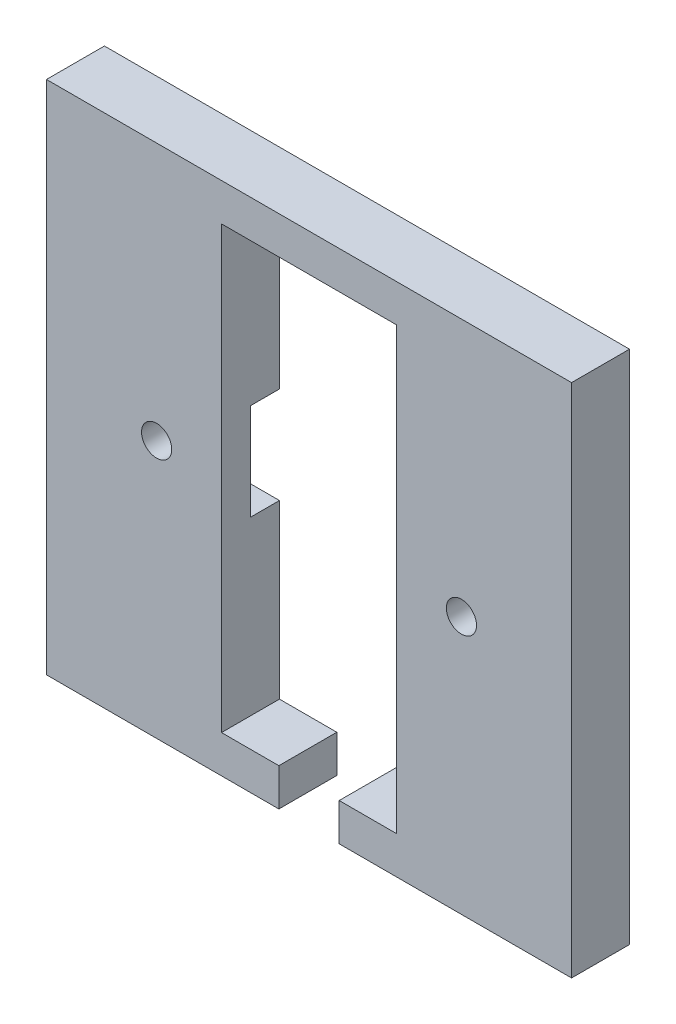
ISO-10303-21;
HEADER;
FILE_DESCRIPTION(('STEP AP214'),'2;1');
FILE_NAME('part.step','',(''),(''),'','','');
FILE_SCHEMA(('AUTOMOTIVE_DESIGN { 1 0 10303 214 1 1 1 1 }'));
ENDSEC;
DATA;
#1=APPLICATION_CONTEXT('core data for automotive mechanical design processes');
#2=APPLICATION_PROTOCOL_DEFINITION('international standard','automotive_design',2000,#1);
#3=PRODUCT_CONTEXT('',#1,'mechanical');
#4=PRODUCT('Part','Part','',(#3));
#5=PRODUCT_RELATED_PRODUCT_CATEGORY('part','',(#4));
#6=PRODUCT_DEFINITION_FORMATION('','',#4);
#7=PRODUCT_DEFINITION_CONTEXT('part definition',#1,'design');
#8=PRODUCT_DEFINITION('design','',#6,#7);
#9=PRODUCT_DEFINITION_SHAPE('','',#8);
#10=(LENGTH_UNIT() NAMED_UNIT(*) SI_UNIT(.MILLI.,.METRE.));
#11=(NAMED_UNIT(*) PLANE_ANGLE_UNIT() SI_UNIT($,.RADIAN.));
#12=(NAMED_UNIT(*) SI_UNIT($,.STERADIAN.) SOLID_ANGLE_UNIT());
#13=UNCERTAINTY_MEASURE_WITH_UNIT(LENGTH_MEASURE(1.E-05),#10,'distance_accuracy_value','');
#14=(GEOMETRIC_REPRESENTATION_CONTEXT(3) GLOBAL_UNCERTAINTY_ASSIGNED_CONTEXT((#13)) GLOBAL_UNIT_ASSIGNED_CONTEXT((#10,
#11,#12)) REPRESENTATION_CONTEXT('',''));
#15=CARTESIAN_POINT('',(0.,0.,0.));
#16=DIRECTION('',(0.,0.,1.));
#17=DIRECTION('',(1.,0.,0.));
#18=AXIS2_PLACEMENT_3D('',#15,#16,#17);
#19=CARTESIAN_POINT('',(-21.75,-21.3584716939112,4.8));
#20=DIRECTION('',(0.,1.,0.));
#21=DIRECTION('',(0.,0.,1.));
#22=AXIS2_PLACEMENT_3D('',#19,#20,#21);
#23=PLANE('',#22);
#24=DIRECTION('',(1.,0.,0.));
#25=VECTOR('',#24,1.);
#26=CARTESIAN_POINT('',(-21.75,-21.3584716939112,4.8));
#27=LINE('',#26,#25);
#28=CARTESIAN_POINT('',(2.5,-21.3584716939112,4.8));
#29=VERTEX_POINT('',#28);
#30=CARTESIAN_POINT('',(21.75,-21.3584716939112,4.8));
#31=VERTEX_POINT('',#30);
#32=EDGE_CURVE('E194',#29,#31,#27,.T.);
#33=ORIENTED_EDGE('',*,*,#32,.F.);
#34=DIRECTION('',(0.,0.,-1.));
#35=VECTOR('',#34,1.);
#36=CARTESIAN_POINT('',(2.5,-21.3584716939112,4.8));
#37=LINE('',#36,#35);
#38=CARTESIAN_POINT('',(2.5,-21.3584716939112,0.));
#39=VERTEX_POINT('',#38);
#40=EDGE_CURVE('E179',#29,#39,#37,.T.);
#41=ORIENTED_EDGE('',*,*,#40,.T.);
#42=DIRECTION('',(1.,0.,0.));
#43=VECTOR('',#42,1.);
#44=CARTESIAN_POINT('',(-21.75,-21.3584716939112,0.));
#45=LINE('',#44,#43);
#46=CARTESIAN_POINT('',(21.75,-21.3584716939112,0.));
#47=VERTEX_POINT('',#46);
#48=EDGE_CURVE('E224',#39,#47,#45,.T.);
#49=ORIENTED_EDGE('',*,*,#48,.T.);
#50=DIRECTION('',(0.,0.,-1.));
#51=VECTOR('',#50,1.);
#52=CARTESIAN_POINT('',(21.75,-21.3584716939112,4.8));
#53=LINE('',#52,#51);
#54=EDGE_CURVE('E202',#31,#47,#53,.T.);
#55=ORIENTED_EDGE('',*,*,#54,.F.);
#56=EDGE_LOOP('',(#33,#41,#49,#55));
#57=FACE_BOUND('',#56,.T.);
#58=ADVANCED_FACE('F43',(#57),#23,.F.);
#59=CARTESIAN_POINT('',(0.,-18.25,-1.2E-05));
#60=DIRECTION('',(0.,-1.,0.));
#61=DIRECTION('',(0.,0.,-1.));
#62=AXIS2_PLACEMENT_3D('',#59,#60,#61);
#63=PLANE('',#62);
#64=DIRECTION('',(-1.,0.,0.));
#65=VECTOR('',#64,1.);
#66=CARTESIAN_POINT('',(0.,-18.25,0.));
#67=LINE('',#66,#65);
#68=CARTESIAN_POINT('',(7.25000000000001,-18.25,0.));
#69=VERTEX_POINT('',#68);
#70=CARTESIAN_POINT('',(2.5,-18.25,0.));
#71=VERTEX_POINT('',#70);
#72=EDGE_CURVE('E247',#69,#71,#67,.T.);
#73=ORIENTED_EDGE('',*,*,#72,.T.);
#74=DIRECTION('',(0.,0.,-1.));
#75=VECTOR('',#74,1.);
#76=CARTESIAN_POINT('',(2.5,-18.25,4.8));
#77=LINE('',#76,#75);
#78=CARTESIAN_POINT('',(2.5,-18.25,4.8));
#79=VERTEX_POINT('',#78);
#80=EDGE_CURVE('E366',#79,#71,#77,.T.);
#81=ORIENTED_EDGE('',*,*,#80,.F.);
#82=DIRECTION('',(1.,0.,0.));
#83=VECTOR('',#82,1.);
#84=CARTESIAN_POINT('',(0.,-18.25,4.8));
#85=LINE('',#84,#83);
#86=CARTESIAN_POINT('',(7.25000000000001,-18.25,4.8));
#87=VERTEX_POINT('',#86);
#88=EDGE_CURVE('E197',#79,#87,#85,.T.);
#89=ORIENTED_EDGE('',*,*,#88,.T.);
#90=DIRECTION('',(0.,0.,1.));
#91=VECTOR('',#90,1.);
#92=CARTESIAN_POINT('',(7.25000000000001,-18.25,-1.2E-05));
#93=LINE('',#92,#91);
#94=EDGE_CURVE('E282',#69,#87,#93,.T.);
#95=ORIENTED_EDGE('',*,*,#94,.F.);
#96=EDGE_LOOP('',(#73,#81,#89,#95));
#97=FACE_BOUND('',#96,.T.);
#98=ADVANCED_FACE('F432',(#97),#63,.F.);
#99=CARTESIAN_POINT('',(0.,0.,0.));
#100=DIRECTION('',(0.,0.,-1.));
#101=DIRECTION('',(-1.,0.,0.));
#102=AXIS2_PLACEMENT_3D('',#99,#100,#101);
#103=PLANE('',#102);
#104=DIRECTION('',(0.,-1.,0.));
#105=VECTOR('',#104,1.);
#106=CARTESIAN_POINT('',(2.5,-18.25,0.));
#107=LINE('',#106,#105);
#108=EDGE_CURVE('E182',#71,#39,#107,.T.);
#109=ORIENTED_EDGE('',*,*,#108,.F.);
#110=ORIENTED_EDGE('',*,*,#72,.F.);
#111=DIRECTION('',(0.,1.,0.));
#112=VECTOR('',#111,1.);
#113=CARTESIAN_POINT('',(7.24999999999999,0.,0.));
#114=LINE('',#113,#112);
#115=CARTESIAN_POINT('',(7.24999999999999,-4.00000000000001,0.));
#116=VERTEX_POINT('',#115);
#117=EDGE_CURVE('E252',#69,#116,#114,.T.);
#118=ORIENTED_EDGE('',*,*,#117,.T.);
#119=DIRECTION('',(-1.,0.,0.));
#120=VECTOR('',#119,1.);
#121=CARTESIAN_POINT('',(0.,-4.00000000000001,0.));
#122=LINE('',#121,#120);
#123=CARTESIAN_POINT('',(19.25,-4.,0.));
#124=VERTEX_POINT('',#123);
#125=EDGE_CURVE('E363',#124,#116,#122,.T.);
#126=ORIENTED_EDGE('',*,*,#125,.F.);
#127=DIRECTION('',(0.,1.,0.));
#128=VECTOR('',#127,1.);
#129=CARTESIAN_POINT('',(19.25,0.,0.));
#130=LINE('',#129,#128);
#131=CARTESIAN_POINT('',(19.25,4.,0.));
#132=VERTEX_POINT('',#131);
#133=EDGE_CURVE('E359',#124,#132,#130,.T.);
#134=ORIENTED_EDGE('',*,*,#133,.T.);
#135=DIRECTION('',(-1.,0.,0.));
#136=VECTOR('',#135,1.);
#137=CARTESIAN_POINT('',(0.,3.99999999999999,0.));
#138=LINE('',#137,#136);
#139=CARTESIAN_POINT('',(7.25,3.99999999999999,0.));
#140=VERTEX_POINT('',#139);
#141=EDGE_CURVE('E354',#132,#140,#138,.T.);
#142=ORIENTED_EDGE('',*,*,#141,.T.);
#143=CARTESIAN_POINT('',(7.25,18.25,0.));
#144=VERTEX_POINT('',#143);
#145=EDGE_CURVE('E251',#140,#144,#114,.T.);
#146=ORIENTED_EDGE('',*,*,#145,.T.);
#147=DIRECTION('',(-1.,0.,0.));
#148=VECTOR('',#147,1.);
#149=CARTESIAN_POINT('',(0.,18.25,0.));
#150=LINE('',#149,#148);
#151=CARTESIAN_POINT('',(-7.25,18.25,0.));
#152=VERTEX_POINT('',#151);
#153=EDGE_CURVE('E255',#144,#152,#150,.T.);
#154=ORIENTED_EDGE('',*,*,#153,.T.);
#155=DIRECTION('',(0.,1.,0.));
#156=VECTOR('',#155,1.);
#157=CARTESIAN_POINT('',(-7.24999999999999,0.,0.));
#158=LINE('',#157,#156);
#159=CARTESIAN_POINT('',(-7.25,3.99999999999999,0.));
#160=VERTEX_POINT('',#159);
#161=EDGE_CURVE('E52',#160,#152,#158,.T.);
#162=ORIENTED_EDGE('',*,*,#161,.F.);
#163=DIRECTION('',(1.,0.,0.));
#164=VECTOR('',#163,1.);
#165=CARTESIAN_POINT('',(0.,3.99999999999999,0.));
#166=LINE('',#165,#164);
#167=CARTESIAN_POINT('',(-19.25,4.,0.));
#168=VERTEX_POINT('',#167);
#169=EDGE_CURVE('E398',#168,#160,#166,.T.);
#170=ORIENTED_EDGE('',*,*,#169,.F.);
#171=DIRECTION('',(0.,1.,0.));
#172=VECTOR('',#171,1.);
#173=CARTESIAN_POINT('',(-19.25,0.,0.));
#174=LINE('',#173,#172);
#175=CARTESIAN_POINT('',(-19.25,-4.,0.));
#176=VERTEX_POINT('',#175);
#177=EDGE_CURVE('E393',#176,#168,#174,.T.);
#178=ORIENTED_EDGE('',*,*,#177,.F.);
#179=DIRECTION('',(1.,0.,0.));
#180=VECTOR('',#179,1.);
#181=CARTESIAN_POINT('',(0.,-4.00000000000001,0.));
#182=LINE('',#181,#180);
#183=CARTESIAN_POINT('',(-7.24999999999999,-4.00000000000001,0.));
#184=VERTEX_POINT('',#183);
#185=EDGE_CURVE('E343',#176,#184,#182,.T.);
#186=ORIENTED_EDGE('',*,*,#185,.T.);
#187=CARTESIAN_POINT('',(-7.25000000000001,-18.25,0.));
#188=VERTEX_POINT('',#187);
#189=EDGE_CURVE('E11',#188,#184,#158,.T.);
#190=ORIENTED_EDGE('',*,*,#189,.F.);
#191=CARTESIAN_POINT('',(-2.5,-18.25,0.));
#192=VERTEX_POINT('',#191);
#193=EDGE_CURVE('E237',#192,#188,#67,.T.);
#194=ORIENTED_EDGE('',*,*,#193,.F.);
#195=DIRECTION('',(0.,1.,0.));
#196=VECTOR('',#195,1.);
#197=CARTESIAN_POINT('',(-2.5,-18.25,0.));
#198=LINE('',#197,#196);
#199=CARTESIAN_POINT('',(-2.5,-21.3584716939112,0.));
#200=VERTEX_POINT('',#199);
#201=EDGE_CURVE('E67',#200,#192,#198,.T.);
#202=ORIENTED_EDGE('',*,*,#201,.F.);
#203=CARTESIAN_POINT('',(-21.75,-21.3584716939112,0.));
#204=VERTEX_POINT('',#203);
#205=EDGE_CURVE('E225',#204,#200,#45,.T.);
#206=ORIENTED_EDGE('',*,*,#205,.F.);
#207=DIRECTION('',(0.,-1.,0.));
#208=VECTOR('',#207,1.);
#209=CARTESIAN_POINT('',(-21.75,18.25,0.));
#210=LINE('',#209,#208);
#211=CARTESIAN_POINT('',(-21.75,21.3584716939112,0.));
#212=VERTEX_POINT('',#211);
#213=EDGE_CURVE('E229',#212,#204,#210,.T.);
#214=ORIENTED_EDGE('',*,*,#213,.F.);
#215=DIRECTION('',(1.,0.,0.));
#216=VECTOR('',#215,1.);
#217=CARTESIAN_POINT('',(-21.75,21.3584716939112,0.));
#218=LINE('',#217,#216);
#219=CARTESIAN_POINT('',(21.75,21.3584716939112,0.));
#220=VERTEX_POINT('',#219);
#221=EDGE_CURVE('E215',#212,#220,#218,.T.);
#222=ORIENTED_EDGE('',*,*,#221,.T.);
#223=DIRECTION('',(0.,-1.,0.));
#224=VECTOR('',#223,1.);
#225=CARTESIAN_POINT('',(21.75,-18.25,0.));
#226=LINE('',#225,#224);
#227=EDGE_CURVE('E219',#220,#47,#226,.T.);
#228=ORIENTED_EDGE('',*,*,#227,.T.);
#229=ORIENTED_EDGE('',*,*,#48,.F.);
#230=EDGE_LOOP('',(#109,#110,#118,#126,#134,#142,#146,#154,#162,#170,#178,#186,#190,#194,#202,
#206,#214,#222,#228,#229));
#231=FACE_BOUND('',#230,.T.);
#232=ADVANCED_FACE('F431',(#231),#103,.T.);
#233=CARTESIAN_POINT('',(-7.24999999999999,0.,-1.2E-05));
#234=DIRECTION('',(-1.,0.,0.));
#235=DIRECTION('',(0.,-1.,0.));
#236=AXIS2_PLACEMENT_3D('',#233,#234,#235);
#237=PLANE('',#236);
#238=DIRECTION('',(0.,0.,-1.));
#239=VECTOR('',#238,1.);
#240=CARTESIAN_POINT('',(-7.24999999999999,-4.00000000000001,2.4));
#241=LINE('',#240,#239);
#242=CARTESIAN_POINT('',(-7.24999999999999,-4.00000000000001,2.4));
#243=VERTEX_POINT('',#242);
#244=EDGE_CURVE('E335',#243,#184,#241,.T.);
#245=ORIENTED_EDGE('',*,*,#244,.F.);
#246=DIRECTION('',(0.,-1.,0.));
#247=VECTOR('',#246,1.);
#248=CARTESIAN_POINT('',(-7.24999999999999,0.,2.4));
#249=LINE('',#248,#247);
#250=CARTESIAN_POINT('',(-7.24999999999998,4.,2.4));
#251=VERTEX_POINT('',#250);
#252=EDGE_CURVE('E414',#251,#243,#249,.T.);
#253=ORIENTED_EDGE('',*,*,#252,.F.);
#254=DIRECTION('',(0.,0.,-1.));
#255=VECTOR('',#254,1.);
#256=CARTESIAN_POINT('',(-7.25,3.99999999999999,2.4));
#257=LINE('',#256,#255);
#258=EDGE_CURVE('E270',#251,#160,#257,.T.);
#259=ORIENTED_EDGE('',*,*,#258,.T.);
#260=ORIENTED_EDGE('',*,*,#161,.T.);
#261=DIRECTION('',(0.,0.,1.));
#262=VECTOR('',#261,1.);
#263=CARTESIAN_POINT('',(-7.25,18.25,-1.2E-05));
#264=LINE('',#263,#262);
#265=CARTESIAN_POINT('',(-7.25,18.25,4.8));
#266=VERTEX_POINT('',#265);
#267=EDGE_CURVE('E220',#152,#266,#264,.T.);
#268=ORIENTED_EDGE('',*,*,#267,.T.);
#269=DIRECTION('',(0.,-1.,0.));
#270=VECTOR('',#269,1.);
#271=CARTESIAN_POINT('',(-7.24999999999999,0.,4.8));
#272=LINE('',#271,#270);
#273=CARTESIAN_POINT('',(-7.25000000000001,-18.25,4.8));
#274=VERTEX_POINT('',#273);
#275=EDGE_CURVE('E326',#266,#274,#272,.T.);
#276=ORIENTED_EDGE('',*,*,#275,.T.);
#277=DIRECTION('',(0.,0.,1.));
#278=VECTOR('',#277,1.);
#279=CARTESIAN_POINT('',(-7.25000000000001,-18.25,-1.2E-05));
#280=LINE('',#279,#278);
#281=EDGE_CURVE('E290',#188,#274,#280,.T.);
#282=ORIENTED_EDGE('',*,*,#281,.F.);
#283=ORIENTED_EDGE('',*,*,#189,.T.);
#284=EDGE_LOOP('',(#245,#253,#259,#260,#268,#276,#282,#283));
#285=FACE_BOUND('',#284,.T.);
#286=ADVANCED_FACE('F266',(#285),#237,.F.);
#287=CARTESIAN_POINT('',(0.,0.,4.8));
#288=DIRECTION('',(0.,0.,-1.));
#289=DIRECTION('',(-1.,0.,0.));
#290=AXIS2_PLACEMENT_3D('',#287,#288,#289);
#291=PLANE('',#290);
#292=ORIENTED_EDGE('',*,*,#88,.F.);
#293=DIRECTION('',(0.,-1.,0.));
#294=VECTOR('',#293,1.);
#295=CARTESIAN_POINT('',(2.5,-18.25,4.8));
#296=LINE('',#295,#294);
#297=EDGE_CURVE('E59',#79,#29,#296,.T.);
#298=ORIENTED_EDGE('',*,*,#297,.T.);
#299=ORIENTED_EDGE('',*,*,#32,.T.);
#300=DIRECTION('',(0.,1.,0.));
#301=VECTOR('',#300,1.);
#302=CARTESIAN_POINT('',(21.75,18.25,4.8));
#303=LINE('',#302,#301);
#304=CARTESIAN_POINT('',(21.75,21.3584716939112,4.8));
#305=VERTEX_POINT('',#304);
#306=EDGE_CURVE('E205',#31,#305,#303,.T.);
#307=ORIENTED_EDGE('',*,*,#306,.T.);
#308=DIRECTION('',(1.,0.,0.));
#309=VECTOR('',#308,1.);
#310=CARTESIAN_POINT('',(-21.75,21.3584716939112,4.8));
#311=LINE('',#310,#309);
#312=CARTESIAN_POINT('',(-21.75,21.3584716939112,4.8));
#313=VERTEX_POINT('',#312);
#314=EDGE_CURVE('E211',#313,#305,#311,.T.);
#315=ORIENTED_EDGE('',*,*,#314,.F.);
#316=DIRECTION('',(0.,1.,0.));
#317=VECTOR('',#316,1.);
#318=CARTESIAN_POINT('',(-21.75,18.25,4.8));
#319=LINE('',#318,#317);
#320=CARTESIAN_POINT('',(-21.75,-21.3584716939112,4.8));
#321=VERTEX_POINT('',#320);
#322=EDGE_CURVE('E232',#321,#313,#319,.T.);
#323=ORIENTED_EDGE('',*,*,#322,.F.);
#324=CARTESIAN_POINT('',(-2.5,-21.3584716939112,4.8));
#325=VERTEX_POINT('',#324);
#326=EDGE_CURVE('E204',#321,#325,#27,.T.);
#327=ORIENTED_EDGE('',*,*,#326,.T.);
#328=DIRECTION('',(0.,1.,0.));
#329=VECTOR('',#328,1.);
#330=CARTESIAN_POINT('',(-2.5,-18.25,4.8));
#331=LINE('',#330,#329);
#332=CARTESIAN_POINT('',(-2.5,-18.25,4.8));
#333=VERTEX_POINT('',#332);
#334=EDGE_CURVE('E188',#325,#333,#331,.T.);
#335=ORIENTED_EDGE('',*,*,#334,.T.);
#336=EDGE_CURVE('E313',#274,#333,#85,.T.);
#337=ORIENTED_EDGE('',*,*,#336,.F.);
#338=ORIENTED_EDGE('',*,*,#275,.F.);
#339=DIRECTION('',(1.,0.,0.));
#340=VECTOR('',#339,1.);
#341=CARTESIAN_POINT('',(0.,18.25,4.8));
#342=LINE('',#341,#340);
#343=CARTESIAN_POINT('',(7.25,18.25,4.8));
#344=VERTEX_POINT('',#343);
#345=EDGE_CURVE('E276',#266,#344,#342,.T.);
#346=ORIENTED_EDGE('',*,*,#345,.T.);
#347=DIRECTION('',(0.,-1.,0.));
#348=VECTOR('',#347,1.);
#349=CARTESIAN_POINT('',(7.24999999999999,0.,4.8));
#350=LINE('',#349,#348);
#351=EDGE_CURVE('E322',#344,#87,#350,.T.);
#352=ORIENTED_EDGE('',*,*,#351,.T.);
#353=EDGE_LOOP('',(#292,#298,#299,#307,#315,#323,#327,#335,#337,#338,#346,#352));
#354=FACE_BOUND('',#353,.T.);
#355=CARTESIAN_POINT('',(12.6254382140631,0.,4.8));
#356=DIRECTION('',(0.,0.,-1.));
#357=DIRECTION('',(-1.,0.,0.));
#358=AXIS2_PLACEMENT_3D('',#355,#356,#357);
#359=CIRCLE('',#358,1.25);
#360=CARTESIAN_POINT('',(13.8754382140631,0.,4.8));
#361=VERTEX_POINT('',#360);
#362=EDGE_CURVE('E331',#361,#361,#359,.T.);
#363=ORIENTED_EDGE('',*,*,#362,.T.);
#364=EDGE_LOOP('',(#363));
#365=FACE_BOUND('',#364,.T.);
#366=CARTESIAN_POINT('',(-12.6254382140631,0.,4.8));
#367=DIRECTION('',(0.,0.,1.));
#368=DIRECTION('',(1.,0.,0.));
#369=AXIS2_PLACEMENT_3D('',#366,#367,#368);
#370=CIRCLE('',#369,1.25);
#371=CARTESIAN_POINT('',(-11.3754382140631,0.,4.8));
#372=VERTEX_POINT('',#371);
#373=EDGE_CURVE('E330',#372,#372,#370,.T.);
#374=ORIENTED_EDGE('',*,*,#373,.F.);
#375=EDGE_LOOP('',(#374));
#376=FACE_BOUND('',#375,.T.);
#377=ADVANCED_FACE('F192',(#354,#365,#376),#291,.F.);
#378=CARTESIAN_POINT('',(-21.75,18.25,4.8));
#379=DIRECTION('',(1.,0.,0.));
#380=DIRECTION('',(0.,0.,-1.));
#381=AXIS2_PLACEMENT_3D('',#378,#379,#380);
#382=PLANE('',#381);
#383=ORIENTED_EDGE('',*,*,#213,.T.);
#384=DIRECTION('',(0.,0.,-1.));
#385=VECTOR('',#384,1.);
#386=CARTESIAN_POINT('',(-21.75,-21.3584716939112,4.8));
#387=LINE('',#386,#385);
#388=EDGE_CURVE('E233',#321,#204,#387,.T.);
#389=ORIENTED_EDGE('',*,*,#388,.F.);
#390=ORIENTED_EDGE('',*,*,#322,.T.);
#391=DIRECTION('',(0.,0.,-1.));
#392=VECTOR('',#391,1.);
#393=CARTESIAN_POINT('',(-21.75,21.3584716939112,4.8));
#394=LINE('',#393,#392);
#395=EDGE_CURVE('E210',#313,#212,#394,.T.);
#396=ORIENTED_EDGE('',*,*,#395,.T.);
#397=EDGE_LOOP('',(#383,#389,#390,#396));
#398=FACE_BOUND('',#397,.T.);
#399=ADVANCED_FACE('F304',(#398),#382,.F.);
#400=ORIENTED_EDGE('',*,*,#205,.T.);
#401=DIRECTION('',(0.,0.,-1.));
#402=VECTOR('',#401,1.);
#403=CARTESIAN_POINT('',(-2.5,-21.3584716939112,4.8));
#404=LINE('',#403,#402);
#405=EDGE_CURVE('E187',#325,#200,#404,.T.);
#406=ORIENTED_EDGE('',*,*,#405,.F.);
#407=ORIENTED_EDGE('',*,*,#326,.F.);
#408=ORIENTED_EDGE('',*,*,#388,.T.);
#409=EDGE_LOOP('',(#400,#406,#407,#408));
#410=FACE_BOUND('',#409,.T.);
#411=ADVANCED_FACE('F309',(#410),#23,.F.);
#412=CARTESIAN_POINT('',(21.75,-18.25,4.8));
#413=DIRECTION('',(1.,0.,0.));
#414=DIRECTION('',(0.,1.,0.));
#415=AXIS2_PLACEMENT_3D('',#412,#413,#414);
#416=PLANE('',#415);
#417=ORIENTED_EDGE('',*,*,#227,.F.);
#418=DIRECTION('',(0.,0.,-1.));
#419=VECTOR('',#418,1.);
#420=CARTESIAN_POINT('',(21.75,21.3584716939112,4.8));
#421=LINE('',#420,#419);
#422=EDGE_CURVE('E240',#305,#220,#421,.T.);
#423=ORIENTED_EDGE('',*,*,#422,.F.);
#424=ORIENTED_EDGE('',*,*,#306,.F.);
#425=ORIENTED_EDGE('',*,*,#54,.T.);
#426=EDGE_LOOP('',(#417,#423,#424,#425));
#427=FACE_BOUND('',#426,.T.);
#428=ADVANCED_FACE('F486',(#427),#416,.T.);
#429=CARTESIAN_POINT('',(-21.75,21.3584716939112,4.8));
#430=DIRECTION('',(0.,1.,0.));
#431=DIRECTION('',(0.,0.,1.));
#432=AXIS2_PLACEMENT_3D('',#429,#430,#431);
#433=PLANE('',#432);
#434=ORIENTED_EDGE('',*,*,#221,.F.);
#435=ORIENTED_EDGE('',*,*,#395,.F.);
#436=ORIENTED_EDGE('',*,*,#314,.T.);
#437=ORIENTED_EDGE('',*,*,#422,.T.);
#438=EDGE_LOOP('',(#434,#435,#436,#437));
#439=FACE_BOUND('',#438,.T.);
#440=ADVANCED_FACE('F45',(#439),#433,.T.);
#441=CARTESIAN_POINT('',(0.,18.25,-1.2E-05));
#442=DIRECTION('',(0.,-1.,0.));
#443=DIRECTION('',(1.,0.,0.));
#444=AXIS2_PLACEMENT_3D('',#441,#442,#443);
#445=PLANE('',#444);
#446=DIRECTION('',(0.,0.,1.));
#447=VECTOR('',#446,1.);
#448=CARTESIAN_POINT('',(7.25,18.25,-1.2E-05));
#449=LINE('',#448,#447);
#450=EDGE_CURVE('E279',#144,#344,#449,.T.);
#451=ORIENTED_EDGE('',*,*,#450,.T.);
#452=ORIENTED_EDGE('',*,*,#345,.F.);
#453=ORIENTED_EDGE('',*,*,#267,.F.);
#454=ORIENTED_EDGE('',*,*,#153,.F.);
#455=EDGE_LOOP('',(#451,#452,#453,#454));
#456=FACE_BOUND('',#455,.T.);
#457=ADVANCED_FACE('F273',(#456),#445,.T.);
#458=CARTESIAN_POINT('',(7.24999999999999,0.,-1.2E-05));
#459=DIRECTION('',(-1.,0.,0.));
#460=DIRECTION('',(0.,-1.,0.));
#461=AXIS2_PLACEMENT_3D('',#458,#459,#460);
#462=PLANE('',#461);
#463=DIRECTION('',(0.,0.,-1.));
#464=VECTOR('',#463,1.);
#465=CARTESIAN_POINT('',(7.24999999999999,-4.00000000000001,2.4));
#466=LINE('',#465,#464);
#467=CARTESIAN_POINT('',(7.24999999999999,-4.00000000000001,2.4));
#468=VERTEX_POINT('',#467);
#469=EDGE_CURVE('E339',#468,#116,#466,.T.);
#470=ORIENTED_EDGE('',*,*,#469,.T.);
#471=ORIENTED_EDGE('',*,*,#117,.F.);
#472=ORIENTED_EDGE('',*,*,#94,.T.);
#473=ORIENTED_EDGE('',*,*,#351,.F.);
#474=ORIENTED_EDGE('',*,*,#450,.F.);
#475=ORIENTED_EDGE('',*,*,#145,.F.);
#476=DIRECTION('',(0.,0.,-1.));
#477=VECTOR('',#476,1.);
#478=CARTESIAN_POINT('',(7.25,3.99999999999999,2.4));
#479=LINE('',#478,#477);
#480=CARTESIAN_POINT('',(7.25,3.99999999999999,2.4));
#481=VERTEX_POINT('',#480);
#482=EDGE_CURVE('E350',#481,#140,#479,.T.);
#483=ORIENTED_EDGE('',*,*,#482,.F.);
#484=DIRECTION('',(0.,-1.,0.));
#485=VECTOR('',#484,1.);
#486=CARTESIAN_POINT('',(7.24999999999999,0.,2.4));
#487=LINE('',#486,#485);
#488=EDGE_CURVE('E358',#481,#468,#487,.T.);
#489=ORIENTED_EDGE('',*,*,#488,.T.);
#490=EDGE_LOOP('',(#470,#471,#472,#473,#474,#475,#483,#489));
#491=FACE_BOUND('',#490,.T.);
#492=ADVANCED_FACE('F436',(#491),#462,.T.);
#493=ORIENTED_EDGE('',*,*,#336,.T.);
#494=DIRECTION('',(0.,0.,-1.));
#495=VECTOR('',#494,1.);
#496=CARTESIAN_POINT('',(-2.5,-18.25,4.8));
#497=LINE('',#496,#495);
#498=EDGE_CURVE('E318',#333,#192,#497,.T.);
#499=ORIENTED_EDGE('',*,*,#498,.T.);
#500=ORIENTED_EDGE('',*,*,#193,.T.);
#501=ORIENTED_EDGE('',*,*,#281,.T.);
#502=EDGE_LOOP('',(#493,#499,#500,#501));
#503=FACE_BOUND('',#502,.T.);
#504=ADVANCED_FACE('F317',(#503),#63,.F.);
#505=CARTESIAN_POINT('',(12.6254382140631,0.,-1.2E-05));
#506=DIRECTION('',(0.,0.,1.));
#507=DIRECTION('',(1.,0.,0.));
#508=AXIS2_PLACEMENT_3D('',#505,#506,#507);
#509=CYLINDRICAL_SURFACE('',#508,1.25);
#510=CARTESIAN_POINT('',(12.6254382140631,0.,2.4));
#511=DIRECTION('',(0.,0.,1.));
#512=DIRECTION('',(1.,0.,0.));
#513=AXIS2_PLACEMENT_3D('',#510,#511,#512);
#514=CIRCLE('',#513,1.25);
#515=CARTESIAN_POINT('',(13.8754382140631,0.,2.4));
#516=VERTEX_POINT('',#515);
#517=EDGE_CURVE('E353',#516,#516,#514,.F.);
#518=CARTESIAN_POINT('',(13.8754382140631,0.,2.4));
#519=CARTESIAN_POINT('',(13.8754382140631,0.,2.425));
#520=CARTESIAN_POINT('',(13.8754382140631,0.,2.45));
#521=CARTESIAN_POINT('',(13.8754382140631,0.,2.5));
#522=CARTESIAN_POINT('',(13.8754382140631,0.,2.525));
#523=CARTESIAN_POINT('',(13.8754382140631,0.,2.575));
#524=CARTESIAN_POINT('',(13.8754382140631,0.,2.6));
#525=CARTESIAN_POINT('',(13.8754382140631,0.,2.65));
#526=CARTESIAN_POINT('',(13.8754382140631,0.,2.675));
#527=CARTESIAN_POINT('',(13.8754382140631,0.,2.725));
#528=CARTESIAN_POINT('',(13.8754382140631,0.,2.75));
#529=CARTESIAN_POINT('',(13.8754382140631,0.,2.8));
#530=CARTESIAN_POINT('',(13.8754382140631,0.,2.825));
#531=CARTESIAN_POINT('',(13.8754382140631,0.,2.875));
#532=CARTESIAN_POINT('',(13.8754382140631,0.,2.9));
#533=CARTESIAN_POINT('',(13.8754382140631,0.,2.95));
#534=CARTESIAN_POINT('',(13.8754382140631,0.,2.975));
#535=CARTESIAN_POINT('',(13.8754382140631,0.,3.025));
#536=CARTESIAN_POINT('',(13.8754382140631,0.,3.05));
#537=CARTESIAN_POINT('',(13.8754382140631,0.,3.1));
#538=CARTESIAN_POINT('',(13.8754382140631,0.,3.125));
#539=CARTESIAN_POINT('',(13.8754382140631,0.,3.175));
#540=CARTESIAN_POINT('',(13.8754382140631,0.,3.2));
#541=CARTESIAN_POINT('',(13.8754382140631,0.,3.25));
#542=CARTESIAN_POINT('',(13.8754382140631,0.,3.275));
#543=CARTESIAN_POINT('',(13.8754382140631,0.,3.325));
#544=CARTESIAN_POINT('',(13.8754382140631,0.,3.35));
#545=CARTESIAN_POINT('',(13.8754382140631,0.,3.4));
#546=CARTESIAN_POINT('',(13.8754382140631,0.,3.425));
#547=CARTESIAN_POINT('',(13.8754382140631,0.,3.475));
#548=CARTESIAN_POINT('',(13.8754382140631,0.,3.5));
#549=CARTESIAN_POINT('',(13.8754382140631,0.,3.55));
#550=CARTESIAN_POINT('',(13.8754382140631,0.,3.575));
#551=CARTESIAN_POINT('',(13.8754382140631,0.,3.625));
#552=CARTESIAN_POINT('',(13.8754382140631,0.,3.65));
#553=CARTESIAN_POINT('',(13.8754382140631,0.,3.7));
#554=CARTESIAN_POINT('',(13.8754382140631,0.,3.725));
#555=CARTESIAN_POINT('',(13.8754382140631,0.,3.775));
#556=CARTESIAN_POINT('',(13.8754382140631,0.,3.8));
#557=CARTESIAN_POINT('',(13.8754382140631,0.,3.85));
#558=CARTESIAN_POINT('',(13.8754382140631,0.,3.875));
#559=CARTESIAN_POINT('',(13.8754382140631,0.,3.925));
#560=CARTESIAN_POINT('',(13.8754382140631,0.,3.95));
#561=CARTESIAN_POINT('',(13.8754382140631,0.,4.));
#562=CARTESIAN_POINT('',(13.8754382140631,0.,4.025));
#563=CARTESIAN_POINT('',(13.8754382140631,0.,4.075));
#564=CARTESIAN_POINT('',(13.8754382140631,0.,4.1));
#565=CARTESIAN_POINT('',(13.8754382140631,0.,4.15));
#566=CARTESIAN_POINT('',(13.8754382140631,0.,4.175));
#567=CARTESIAN_POINT('',(13.8754382140631,0.,4.225));
#568=CARTESIAN_POINT('',(13.8754382140631,0.,4.25));
#569=CARTESIAN_POINT('',(13.8754382140631,0.,4.3));
#570=CARTESIAN_POINT('',(13.8754382140631,0.,4.325));
#571=CARTESIAN_POINT('',(13.8754382140631,0.,4.375));
#572=CARTESIAN_POINT('',(13.8754382140631,0.,4.4));
#573=CARTESIAN_POINT('',(13.8754382140631,0.,4.45));
#574=CARTESIAN_POINT('',(13.8754382140631,0.,4.475));
#575=CARTESIAN_POINT('',(13.8754382140631,0.,4.525));
#576=CARTESIAN_POINT('',(13.8754382140631,0.,4.55));
#577=CARTESIAN_POINT('',(13.8754382140631,0.,4.6));
#578=CARTESIAN_POINT('',(13.8754382140631,0.,4.625));
#579=CARTESIAN_POINT('',(13.8754382140631,0.,4.675));
#580=CARTESIAN_POINT('',(13.8754382140631,0.,4.7));
#581=CARTESIAN_POINT('',(13.8754382140631,0.,4.75));
#582=CARTESIAN_POINT('',(13.8754382140631,0.,4.775));
#583=CARTESIAN_POINT('',(13.8754382140631,0.,4.8));
#584=B_SPLINE_CURVE_WITH_KNOTS('',3,(#518,#519,#520,#521,#522,#523,#524,#525,#526,#527,#528,
#529,#530,#531,#532,#533,#534,#535,#536,#537,#538,#539,#540,#541,#542,#543,#544,#545,#546,#547,
#548,#549,#550,#551,#552,#553,#554,#555,#556,#557,#558,#559,#560,#561,#562,#563,#564,#565,#566,
#567,#568,#569,#570,#571,#572,#573,#574,#575,#576,#577,#578,#579,#580,#581,#582,#583),
.UNSPECIFIED.,.F.,.F.,(4,2,2,2,2,2,2,2,2,2,2,2,2,2,2,2,2,2,2,2,2,2,2,2,2,2,2,2,2,2,2,2,4),(0.,
0.075,0.15,0.225,0.3,0.375,0.45,0.525,0.6,0.675,0.75,0.825,0.900000000000001,0.975,1.05,1.125,
1.2,1.275,1.35,1.425,1.5,1.575,1.65,1.725,1.8,1.875,1.95,2.025,2.1,2.175,2.25,2.325,2.4),.UNSPECIFIED.);
#585=EDGE_CURVE('BSEAM502',#516,#361,#584,.T.);
#586=ORIENTED_EDGE('',*,*,#517,.T.);
#587=ORIENTED_EDGE('',*,*,#362,.F.);
#588=ORIENTED_EDGE('',*,*,#585,.T.);
#589=ORIENTED_EDGE('',*,*,#585,.F.);
#590=EDGE_LOOP('',(#586,#588,#587,#589));
#591=FACE_BOUND('',#590,.T.);
#592=ADVANCED_FACE('F502',(#591),#509,.F.);
#593=CARTESIAN_POINT('',(-12.6254382140631,0.,-1.2E-05));
#594=DIRECTION('',(0.,0.,1.));
#595=DIRECTION('',(1.,0.,0.));
#596=AXIS2_PLACEMENT_3D('',#593,#594,#595);
#597=CYLINDRICAL_SURFACE('',#596,1.25);
#598=CARTESIAN_POINT('',(-12.6254382140631,0.,2.4));
#599=DIRECTION('',(0.,0.,1.));
#600=DIRECTION('',(1.,0.,0.));
#601=AXIS2_PLACEMENT_3D('',#598,#599,#600);
#602=CIRCLE('',#601,1.25);
#603=CARTESIAN_POINT('',(-11.3754382140631,0.,2.4));
#604=VERTEX_POINT('',#603);
#605=EDGE_CURVE('E392',#604,#604,#602,.T.);
#606=CARTESIAN_POINT('',(-11.3754382140631,0.,2.4));
#607=CARTESIAN_POINT('',(-11.3754382140631,0.,2.425));
#608=CARTESIAN_POINT('',(-11.3754382140631,0.,2.45));
#609=CARTESIAN_POINT('',(-11.3754382140631,0.,2.5));
#610=CARTESIAN_POINT('',(-11.3754382140631,0.,2.525));
#611=CARTESIAN_POINT('',(-11.3754382140631,0.,2.575));
#612=CARTESIAN_POINT('',(-11.3754382140631,0.,2.6));
#613=CARTESIAN_POINT('',(-11.3754382140631,0.,2.65));
#614=CARTESIAN_POINT('',(-11.3754382140631,0.,2.675));
#615=CARTESIAN_POINT('',(-11.3754382140631,0.,2.725));
#616=CARTESIAN_POINT('',(-11.3754382140631,0.,2.75));
#617=CARTESIAN_POINT('',(-11.3754382140631,0.,2.8));
#618=CARTESIAN_POINT('',(-11.3754382140631,0.,2.825));
#619=CARTESIAN_POINT('',(-11.3754382140631,0.,2.875));
#620=CARTESIAN_POINT('',(-11.3754382140631,0.,2.9));
#621=CARTESIAN_POINT('',(-11.3754382140631,0.,2.95));
#622=CARTESIAN_POINT('',(-11.3754382140631,0.,2.975));
#623=CARTESIAN_POINT('',(-11.3754382140631,0.,3.025));
#624=CARTESIAN_POINT('',(-11.3754382140631,0.,3.05));
#625=CARTESIAN_POINT('',(-11.3754382140631,0.,3.1));
#626=CARTESIAN_POINT('',(-11.3754382140631,0.,3.125));
#627=CARTESIAN_POINT('',(-11.3754382140631,0.,3.175));
#628=CARTESIAN_POINT('',(-11.3754382140631,0.,3.2));
#629=CARTESIAN_POINT('',(-11.3754382140631,0.,3.25));
#630=CARTESIAN_POINT('',(-11.3754382140631,0.,3.275));
#631=CARTESIAN_POINT('',(-11.3754382140631,0.,3.325));
#632=CARTESIAN_POINT('',(-11.3754382140631,0.,3.35));
#633=CARTESIAN_POINT('',(-11.3754382140631,0.,3.4));
#634=CARTESIAN_POINT('',(-11.3754382140631,0.,3.425));
#635=CARTESIAN_POINT('',(-11.3754382140631,0.,3.475));
#636=CARTESIAN_POINT('',(-11.3754382140631,0.,3.5));
#637=CARTESIAN_POINT('',(-11.3754382140631,0.,3.55));
#638=CARTESIAN_POINT('',(-11.3754382140631,0.,3.575));
#639=CARTESIAN_POINT('',(-11.3754382140631,0.,3.625));
#640=CARTESIAN_POINT('',(-11.3754382140631,0.,3.65));
#641=CARTESIAN_POINT('',(-11.3754382140631,0.,3.7));
#642=CARTESIAN_POINT('',(-11.3754382140631,0.,3.725));
#643=CARTESIAN_POINT('',(-11.3754382140631,0.,3.775));
#644=CARTESIAN_POINT('',(-11.3754382140631,0.,3.8));
#645=CARTESIAN_POINT('',(-11.3754382140631,0.,3.85));
#646=CARTESIAN_POINT('',(-11.3754382140631,0.,3.875));
#647=CARTESIAN_POINT('',(-11.3754382140631,0.,3.925));
#648=CARTESIAN_POINT('',(-11.3754382140631,0.,3.95));
#649=CARTESIAN_POINT('',(-11.3754382140631,0.,4.));
#650=CARTESIAN_POINT('',(-11.3754382140631,0.,4.025));
#651=CARTESIAN_POINT('',(-11.3754382140631,0.,4.075));
#652=CARTESIAN_POINT('',(-11.3754382140631,0.,4.1));
#653=CARTESIAN_POINT('',(-11.3754382140631,0.,4.15));
#654=CARTESIAN_POINT('',(-11.3754382140631,0.,4.175));
#655=CARTESIAN_POINT('',(-11.3754382140631,0.,4.225));
#656=CARTESIAN_POINT('',(-11.3754382140631,0.,4.25));
#657=CARTESIAN_POINT('',(-11.3754382140631,0.,4.3));
#658=CARTESIAN_POINT('',(-11.3754382140631,0.,4.325));
#659=CARTESIAN_POINT('',(-11.3754382140631,0.,4.375));
#660=CARTESIAN_POINT('',(-11.3754382140631,0.,4.4));
#661=CARTESIAN_POINT('',(-11.3754382140631,0.,4.45));
#662=CARTESIAN_POINT('',(-11.3754382140631,0.,4.475));
#663=CARTESIAN_POINT('',(-11.3754382140631,0.,4.525));
#664=CARTESIAN_POINT('',(-11.3754382140631,0.,4.55));
#665=CARTESIAN_POINT('',(-11.3754382140631,0.,4.6));
#666=CARTESIAN_POINT('',(-11.3754382140631,0.,4.625));
#667=CARTESIAN_POINT('',(-11.3754382140631,0.,4.675));
#668=CARTESIAN_POINT('',(-11.3754382140631,0.,4.7));
#669=CARTESIAN_POINT('',(-11.3754382140631,0.,4.75));
#670=CARTESIAN_POINT('',(-11.3754382140631,0.,4.775));
#671=CARTESIAN_POINT('',(-11.3754382140631,0.,4.8));
#672=B_SPLINE_CURVE_WITH_KNOTS('',3,(#606,#607,#608,#609,#610,#611,#612,#613,#614,#615,#616,
#617,#618,#619,#620,#621,#622,#623,#624,#625,#626,#627,#628,#629,#630,#631,#632,#633,#634,#635,
#636,#637,#638,#639,#640,#641,#642,#643,#644,#645,#646,#647,#648,#649,#650,#651,#652,#653,#654,
#655,#656,#657,#658,#659,#660,#661,#662,#663,#664,#665,#666,#667,#668,#669,#670,#671),
.UNSPECIFIED.,.F.,.F.,(4,2,2,2,2,2,2,2,2,2,2,2,2,2,2,2,2,2,2,2,2,2,2,2,2,2,2,2,2,2,2,2,4),(0.,
0.075,0.15,0.225,0.3,0.375,0.45,0.525,0.6,0.675,0.75,0.825,0.9,0.975,1.05,1.125,1.2,1.275,1.35,
1.425,1.5,1.575,1.65,1.725,1.8,1.875,1.95,2.025,2.1,2.175,2.25,2.325,2.4),.UNSPECIFIED.);
#673=EDGE_CURVE('BSEAM509',#604,#372,#672,.T.);
#674=ORIENTED_EDGE('',*,*,#605,.F.);
#675=ORIENTED_EDGE('',*,*,#373,.T.);
#676=ORIENTED_EDGE('',*,*,#673,.T.);
#677=ORIENTED_EDGE('',*,*,#673,.F.);
#678=EDGE_LOOP('',(#674,#676,#675,#677));
#679=FACE_BOUND('',#678,.T.);
#680=ADVANCED_FACE('F509',(#679),#597,.F.);
#681=CARTESIAN_POINT('',(0.,-4.00000000000001,2.4));
#682=DIRECTION('',(0.,1.,0.));
#683=DIRECTION('',(-1.,0.,0.));
#684=AXIS2_PLACEMENT_3D('',#681,#682,#683);
#685=PLANE('',#684);
#686=ORIENTED_EDGE('',*,*,#185,.F.);
#687=DIRECTION('',(0.,0.,-1.));
#688=VECTOR('',#687,1.);
#689=CARTESIAN_POINT('',(-19.25,-4.,2.4));
#690=LINE('',#689,#688);
#691=CARTESIAN_POINT('',(-19.25,-4.,2.4));
#692=VERTEX_POINT('',#691);
#693=EDGE_CURVE('E389',#692,#176,#690,.T.);
#694=ORIENTED_EDGE('',*,*,#693,.F.);
#695=DIRECTION('',(1.,0.,0.));
#696=VECTOR('',#695,1.);
#697=CARTESIAN_POINT('',(0.,-4.00000000000001,2.4));
#698=LINE('',#697,#696);
#699=EDGE_CURVE('E397',#692,#243,#698,.T.);
#700=ORIENTED_EDGE('',*,*,#699,.T.);
#701=ORIENTED_EDGE('',*,*,#244,.T.);
#702=EDGE_LOOP('',(#686,#694,#700,#701));
#703=FACE_BOUND('',#702,.T.);
#704=ADVANCED_FACE('F459',(#703),#685,.T.);
#705=CARTESIAN_POINT('',(0.,3.99999999999999,2.4));
#706=DIRECTION('',(0.,1.,0.));
#707=DIRECTION('',(-1.,0.,0.));
#708=AXIS2_PLACEMENT_3D('',#705,#706,#707);
#709=PLANE('',#708);
#710=ORIENTED_EDGE('',*,*,#169,.T.);
#711=ORIENTED_EDGE('',*,*,#258,.F.);
#712=DIRECTION('',(1.,0.,0.));
#713=VECTOR('',#712,1.);
#714=CARTESIAN_POINT('',(0.,3.99999999999999,2.4));
#715=LINE('',#714,#713);
#716=CARTESIAN_POINT('',(-19.25,4.,2.4));
#717=VERTEX_POINT('',#716);
#718=EDGE_CURVE('E411',#717,#251,#715,.T.);
#719=ORIENTED_EDGE('',*,*,#718,.F.);
#720=DIRECTION('',(0.,0.,-1.));
#721=VECTOR('',#720,1.);
#722=CARTESIAN_POINT('',(-19.25,4.,2.4));
#723=LINE('',#722,#721);
#724=EDGE_CURVE('E386',#717,#168,#723,.T.);
#725=ORIENTED_EDGE('',*,*,#724,.T.);
#726=EDGE_LOOP('',(#710,#711,#719,#725));
#727=FACE_BOUND('',#726,.T.);
#728=ADVANCED_FACE('F467',(#727),#709,.F.);
#729=CARTESIAN_POINT('',(-19.25,0.,2.4));
#730=DIRECTION('',(-1.,0.,0.));
#731=DIRECTION('',(0.,0.,1.));
#732=AXIS2_PLACEMENT_3D('',#729,#730,#731);
#733=PLANE('',#732);
#734=ORIENTED_EDGE('',*,*,#177,.T.);
#735=ORIENTED_EDGE('',*,*,#724,.F.);
#736=DIRECTION('',(0.,1.,0.));
#737=VECTOR('',#736,1.);
#738=CARTESIAN_POINT('',(-19.25,0.,2.4));
#739=LINE('',#738,#737);
#740=EDGE_CURVE('E407',#692,#717,#739,.T.);
#741=ORIENTED_EDGE('',*,*,#740,.F.);
#742=ORIENTED_EDGE('',*,*,#693,.T.);
#743=EDGE_LOOP('',(#734,#735,#741,#742));
#744=FACE_BOUND('',#743,.T.);
#745=ADVANCED_FACE('F469',(#744),#733,.F.);
#746=CARTESIAN_POINT('',(0.,0.,2.4));
#747=DIRECTION('',(0.,0.,1.));
#748=DIRECTION('',(1.,0.,0.));
#749=AXIS2_PLACEMENT_3D('',#746,#747,#748);
#750=PLANE('',#749);
#751=ORIENTED_EDGE('',*,*,#699,.F.);
#752=ORIENTED_EDGE('',*,*,#740,.T.);
#753=ORIENTED_EDGE('',*,*,#718,.T.);
#754=ORIENTED_EDGE('',*,*,#252,.T.);
#755=EDGE_LOOP('',(#751,#752,#753,#754));
#756=FACE_BOUND('',#755,.T.);
#757=ORIENTED_EDGE('',*,*,#605,.T.);
#758=EDGE_LOOP('',(#757));
#759=FACE_BOUND('',#758,.T.);
#760=ADVANCED_FACE('F462',(#756,#759),#750,.F.);
#761=CARTESIAN_POINT('',(0.,-4.00000000000001,2.4));
#762=DIRECTION('',(0.,-1.,0.));
#763=DIRECTION('',(1.,0.,0.));
#764=AXIS2_PLACEMENT_3D('',#761,#762,#763);
#765=PLANE('',#764);
#766=ORIENTED_EDGE('',*,*,#125,.T.);
#767=ORIENTED_EDGE('',*,*,#469,.F.);
#768=DIRECTION('',(-1.,0.,0.));
#769=VECTOR('',#768,1.);
#770=CARTESIAN_POINT('',(0.,-4.00000000000001,2.4));
#771=LINE('',#770,#769);
#772=CARTESIAN_POINT('',(19.25,-4.,2.4));
#773=VERTEX_POINT('',#772);
#774=EDGE_CURVE('E376',#773,#468,#771,.T.);
#775=ORIENTED_EDGE('',*,*,#774,.F.);
#776=DIRECTION('',(0.,0.,-1.));
#777=VECTOR('',#776,1.);
#778=CARTESIAN_POINT('',(19.25,-4.,2.4));
#779=LINE('',#778,#777);
#780=EDGE_CURVE('E344',#773,#124,#779,.T.);
#781=ORIENTED_EDGE('',*,*,#780,.T.);
#782=EDGE_LOOP('',(#766,#767,#775,#781));
#783=FACE_BOUND('',#782,.T.);
#784=ADVANCED_FACE('F441',(#783),#765,.F.);
#785=CARTESIAN_POINT('',(19.25,0.,2.4));
#786=DIRECTION('',(-1.,0.,0.));
#787=DIRECTION('',(0.,0.,1.));
#788=AXIS2_PLACEMENT_3D('',#785,#786,#787);
#789=PLANE('',#788);
#790=ORIENTED_EDGE('',*,*,#133,.F.);
#791=ORIENTED_EDGE('',*,*,#780,.F.);
#792=DIRECTION('',(0.,1.,0.));
#793=VECTOR('',#792,1.);
#794=CARTESIAN_POINT('',(19.25,0.,2.4));
#795=LINE('',#794,#793);
#796=CARTESIAN_POINT('',(19.25,4.,2.4));
#797=VERTEX_POINT('',#796);
#798=EDGE_CURVE('E373',#773,#797,#795,.T.);
#799=ORIENTED_EDGE('',*,*,#798,.T.);
#800=DIRECTION('',(0.,0.,-1.));
#801=VECTOR('',#800,1.);
#802=CARTESIAN_POINT('',(19.25,4.,2.4));
#803=LINE('',#802,#801);
#804=EDGE_CURVE('E347',#797,#132,#803,.T.);
#805=ORIENTED_EDGE('',*,*,#804,.T.);
#806=EDGE_LOOP('',(#790,#791,#799,#805));
#807=FACE_BOUND('',#806,.T.);
#808=ADVANCED_FACE('F445',(#807),#789,.T.);
#809=CARTESIAN_POINT('',(0.,3.99999999999999,2.4));
#810=DIRECTION('',(0.,-1.,0.));
#811=DIRECTION('',(1.,0.,0.));
#812=AXIS2_PLACEMENT_3D('',#809,#810,#811);
#813=PLANE('',#812);
#814=ORIENTED_EDGE('',*,*,#141,.F.);
#815=ORIENTED_EDGE('',*,*,#804,.F.);
#816=DIRECTION('',(-1.,0.,0.));
#817=VECTOR('',#816,1.);
#818=CARTESIAN_POINT('',(0.,3.99999999999999,2.4));
#819=LINE('',#818,#817);
#820=EDGE_CURVE('E370',#797,#481,#819,.T.);
#821=ORIENTED_EDGE('',*,*,#820,.T.);
#822=ORIENTED_EDGE('',*,*,#482,.T.);
#823=EDGE_LOOP('',(#814,#815,#821,#822));
#824=FACE_BOUND('',#823,.T.);
#825=ADVANCED_FACE('F450',(#824),#813,.T.);
#826=CARTESIAN_POINT('',(0.,0.,2.4));
#827=DIRECTION('',(0.,0.,1.));
#828=DIRECTION('',(1.,0.,0.));
#829=AXIS2_PLACEMENT_3D('',#826,#827,#828);
#830=PLANE('',#829);
#831=ORIENTED_EDGE('',*,*,#488,.F.);
#832=ORIENTED_EDGE('',*,*,#820,.F.);
#833=ORIENTED_EDGE('',*,*,#798,.F.);
#834=ORIENTED_EDGE('',*,*,#774,.T.);
#835=EDGE_LOOP('',(#831,#832,#833,#834));
#836=FACE_BOUND('',#835,.T.);
#837=ORIENTED_EDGE('',*,*,#517,.F.);
#838=EDGE_LOOP('',(#837));
#839=FACE_BOUND('',#838,.T.);
#840=ADVANCED_FACE('F520',(#836,#839),#830,.F.);
#841=CARTESIAN_POINT('',(-2.5,-18.25,4.8));
#842=DIRECTION('',(-1.,0.,0.));
#843=DIRECTION('',(0.,-1.,0.));
#844=AXIS2_PLACEMENT_3D('',#841,#842,#843);
#845=PLANE('',#844);
#846=ORIENTED_EDGE('',*,*,#201,.T.);
#847=ORIENTED_EDGE('',*,*,#498,.F.);
#848=ORIENTED_EDGE('',*,*,#334,.F.);
#849=ORIENTED_EDGE('',*,*,#405,.T.);
#850=EDGE_LOOP('',(#846,#847,#848,#849));
#851=FACE_BOUND('',#850,.T.);
#852=ADVANCED_FACE('F523',(#851),#845,.F.);
#853=CARTESIAN_POINT('',(2.5,-18.25,4.8));
#854=DIRECTION('',(1.,0.,0.));
#855=DIRECTION('',(0.,1.,0.));
#856=AXIS2_PLACEMENT_3D('',#853,#854,#855);
#857=PLANE('',#856);
#858=ORIENTED_EDGE('',*,*,#108,.T.);
#859=ORIENTED_EDGE('',*,*,#40,.F.);
#860=ORIENTED_EDGE('',*,*,#297,.F.);
#861=ORIENTED_EDGE('',*,*,#80,.T.);
#862=EDGE_LOOP('',(#858,#859,#860,#861));
#863=FACE_BOUND('',#862,.T.);
#864=ADVANCED_FACE('F180',(#863),#857,.F.);
#865=CLOSED_SHELL('',(#58,#98,#232,#286,#377,#399,#411,#428,#440,#457,#492,#504,#592,#680,#704,
#728,#745,#760,#784,#808,#825,#840,#852,#864));
#866=MANIFOLD_SOLID_BREP('B2',#865);
#867=ADVANCED_BREP_SHAPE_REPRESENTATION('',(#18,#866),#14);
#868=SHAPE_DEFINITION_REPRESENTATION(#9,#867);
ENDSEC;
END-ISO-10303-21;
